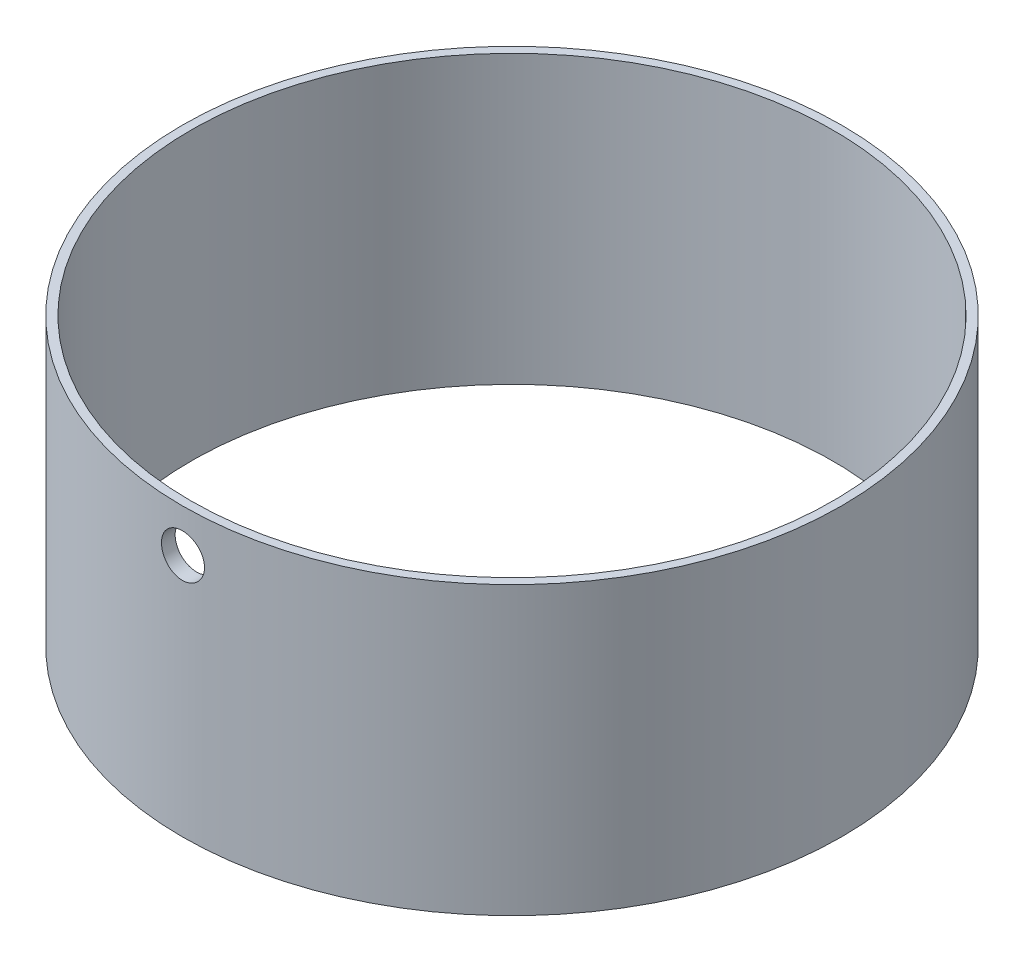
ISO-10303-21;
HEADER;
FILE_DESCRIPTION(('STEP AP214'),'2;1');
FILE_NAME('part.step','',(''),(''),'','','');
FILE_SCHEMA(('AUTOMOTIVE_DESIGN { 1 0 10303 214 1 1 1 1 }'));
ENDSEC;
DATA;
#1=APPLICATION_CONTEXT('core data for automotive mechanical design processes');
#2=APPLICATION_PROTOCOL_DEFINITION('international standard','automotive_design',2000,#1);
#3=PRODUCT_CONTEXT('',#1,'mechanical');
#4=PRODUCT('Part','Part','',(#3));
#5=PRODUCT_RELATED_PRODUCT_CATEGORY('part','',(#4));
#6=PRODUCT_DEFINITION_FORMATION('','',#4);
#7=PRODUCT_DEFINITION_CONTEXT('part definition',#1,'design');
#8=PRODUCT_DEFINITION('design','',#6,#7);
#9=PRODUCT_DEFINITION_SHAPE('','',#8);
#10=(LENGTH_UNIT() NAMED_UNIT(*) SI_UNIT(.MILLI.,.METRE.));
#11=(NAMED_UNIT(*) PLANE_ANGLE_UNIT() SI_UNIT($,.RADIAN.));
#12=(NAMED_UNIT(*) SI_UNIT($,.STERADIAN.) SOLID_ANGLE_UNIT());
#13=UNCERTAINTY_MEASURE_WITH_UNIT(LENGTH_MEASURE(1.E-05),#10,'distance_accuracy_value','');
#14=(GEOMETRIC_REPRESENTATION_CONTEXT(3) GLOBAL_UNCERTAINTY_ASSIGNED_CONTEXT((#13)) GLOBAL_UNIT_ASSIGNED_CONTEXT((#10,
#11,#12)) REPRESENTATION_CONTEXT('',''));
#15=CARTESIAN_POINT('',(0.,0.,0.));
#16=DIRECTION('',(0.,0.,1.));
#17=DIRECTION('',(1.,0.,0.));
#18=AXIS2_PLACEMENT_3D('',#15,#16,#17);
#19=CARTESIAN_POINT('',(0.,0.,0.));
#20=DIRECTION('',(0.,1.,0.));
#21=DIRECTION('',(0.,0.,1.));
#22=AXIS2_PLACEMENT_3D('',#19,#20,#21);
#23=CYLINDRICAL_SURFACE('',#22,112.);
#24=CARTESIAN_POINT('',(0.,100.,0.));
#25=DIRECTION('',(0.,1.,0.));
#26=DIRECTION('',(0.,0.,1.));
#27=AXIS2_PLACEMENT_3D('',#24,#25,#26);
#28=CIRCLE('',#27,112.);
#29=CARTESIAN_POINT('',(0.,100.,112.));
#30=VERTEX_POINT('',#29);
#31=EDGE_CURVE('E118',#30,#30,#28,.T.);
#32=ORIENTED_EDGE('',*,*,#31,.T.);
#33=EDGE_LOOP('',(#32));
#34=FACE_BOUND('',#33,.T.);
#35=CARTESIAN_POINT('',(0.,0.,0.));
#36=DIRECTION('',(0.,1.,0.));
#37=DIRECTION('',(0.,0.,1.));
#38=AXIS2_PLACEMENT_3D('',#35,#36,#37);
#39=CIRCLE('',#38,112.);
#40=CARTESIAN_POINT('',(0.,0.,112.));
#41=VERTEX_POINT('',#40);
#42=EDGE_CURVE('E119',#41,#41,#39,.T.);
#43=ORIENTED_EDGE('',*,*,#42,.F.);
#44=EDGE_LOOP('',(#43));
#45=FACE_BOUND('',#44,.T.);
#46=DIRECTION('',(0.,1.,0.));
#47=VECTOR('',#46,1.);
#48=CARTESIAN_POINT('',(-11.8113619735154,0.,111.375453886081));
#49=LINE('',#48,#47);
#50=CARTESIAN_POINT('',(-11.8113619735154,69.,111.375453886081));
#51=VERTEX_POINT('',#50);
#52=CARTESIAN_POINT('',(-11.8113619735154,95.,111.375453886081));
#53=VERTEX_POINT('',#52);
#54=EDGE_CURVE('E11',#51,#53,#49,.T.);
#55=ORIENTED_EDGE('',*,*,#54,.F.);
#56=CARTESIAN_POINT('',(0.,69.,0.));
#57=DIRECTION('',(0.,1.,0.));
#58=DIRECTION('',(0.,0.,1.));
#59=AXIS2_PLACEMENT_3D('',#56,#57,#58);
#60=CIRCLE('',#59,112.);
#61=CARTESIAN_POINT('',(12.1886380264846,69.,111.334797359403));
#62=VERTEX_POINT('',#61);
#63=EDGE_CURVE('E55',#62,#51,#60,.F.);
#64=ORIENTED_EDGE('',*,*,#63,.F.);
#65=DIRECTION('',(0.,1.,0.));
#66=VECTOR('',#65,1.);
#67=CARTESIAN_POINT('',(12.1886380264846,0.,111.334797359403));
#68=LINE('',#67,#66);
#69=CARTESIAN_POINT('',(12.1886380264846,95.,111.334797359403));
#70=VERTEX_POINT('',#69);
#71=EDGE_CURVE('E153',#70,#62,#68,.F.);
#72=ORIENTED_EDGE('',*,*,#71,.F.);
#73=CARTESIAN_POINT('',(0.,95.,0.));
#74=DIRECTION('',(0.,-1.,0.));
#75=DIRECTION('',(0.,0.,-1.));
#76=AXIS2_PLACEMENT_3D('',#73,#74,#75);
#77=CIRCLE('',#76,112.);
#78=EDGE_CURVE('E48',#53,#70,#77,.F.);
#79=ORIENTED_EDGE('',*,*,#78,.F.);
#80=EDGE_LOOP('',(#55,#64,#72,#79));
#81=FACE_BOUND('',#80,.T.);
#82=ADVANCED_FACE('F39',(#34,#45,#81),#23,.F.);
#83=CARTESIAN_POINT('',(0.,85.,115.));
#84=DIRECTION('',(0.,0.,-1.));
#85=DIRECTION('',(-1.,0.,0.));
#86=AXIS2_PLACEMENT_3D('',#83,#84,#85);
#87=CYLINDRICAL_SURFACE('',#86,7.5);
#88=CARTESIAN_POINT('',(0.,77.5,115.));
#89=CARTESIAN_POINT('',(0.210474437116549,77.4999982600035,115.000000312665));
#90=CARTESIAN_POINT('',(0.420921203214331,77.5088634147188,114.999420984195));
#91=CARTESIAN_POINT('',(0.840385809894541,77.5442605031269,114.997120521563));
#92=CARTESIAN_POINT('',(1.04940327510685,77.5707969103353,114.995399098278));
#93=CARTESIAN_POINT('',(1.46462725009668,77.6413820683434,114.99086060133));
#94=CARTESIAN_POINT('',(1.67083121296599,77.6854457217624,114.988042595337));
#95=CARTESIAN_POINT('',(2.07885902563251,77.7907867532695,114.981389771491));
#96=CARTESIAN_POINT('',(2.28068124474147,77.8520704254684,114.977554581876));
#97=CARTESIAN_POINT('',(2.67825253362003,77.9913418565619,114.968980455738));
#98=CARTESIAN_POINT('',(2.87400691294481,78.0693145109448,114.964242336842));
#99=CARTESIAN_POINT('',(3.25831807573895,78.2414711128006,114.953992238501));
#100=CARTESIAN_POINT('',(3.44687217839751,78.33566102776,114.948479974329));
#101=CARTESIAN_POINT('',(3.81526256188343,78.5394999625754,114.936842304033));
#102=CARTESIAN_POINT('',(3.9951039903634,78.6491397008617,114.930717266672));
#103=CARTESIAN_POINT('',(4.34498611503264,78.8831862161373,114.918021901165));
#104=CARTESIAN_POINT('',(4.51502316360376,79.0075984370824,114.911451409246));
#105=CARTESIAN_POINT('',(4.84419995827742,79.2704161250919,114.898045658649));
#106=CARTESIAN_POINT('',(5.00332796520436,79.4088362815261,114.891210126768));
#107=CARTESIAN_POINT('',(5.3094209529795,79.698633720509,114.877471833506));
#108=CARTESIAN_POINT('',(5.45638141884931,79.8500157707857,114.870569048222));
#109=CARTESIAN_POINT('',(5.7370127827864,80.1645985958104,114.856895410108));
#110=CARTESIAN_POINT('',(5.87068566738485,80.327797597566,114.850124537679));
#111=CARTESIAN_POINT('',(6.12382156322772,80.6648833620762,114.836905562634));
#112=CARTESIAN_POINT('',(6.24328435884064,80.8387702869544,114.830457464917));
#113=CARTESIAN_POINT('',(6.46724581204258,81.1961545214373,114.818061848391));
#114=CARTESIAN_POINT('',(6.57173145788298,81.3796600006532,114.812114766678));
#115=CARTESIAN_POINT('',(6.76487226423058,81.754846487637,114.800896626755));
#116=CARTESIAN_POINT('',(6.85352704251246,81.9465276926637,114.79562558487));
#117=CARTESIAN_POINT('',(7.01435231829256,82.3366618298179,114.785910959871));
#118=CARTESIAN_POINT('',(7.08652601885355,82.5351134374999,114.781467216006));
#119=CARTESIAN_POINT('',(7.21391465008896,82.9374814912433,114.773531415436));
#120=CARTESIAN_POINT('',(7.26912371125492,83.1413998022302,114.770039688162));
#121=CARTESIAN_POINT('',(7.36207580073377,83.552847491273,114.764114634974));
#122=CARTESIAN_POINT('',(7.39984691594251,83.760370499848,114.761679607442));
#123=CARTESIAN_POINT('',(7.45778278073224,84.177873016836,114.757929227638));
#124=CARTESIAN_POINT('',(7.47794728160642,84.3878525599071,114.756613891183));
#125=CARTESIAN_POINT('',(7.50052298101,84.8087617344913,114.755140554855));
#126=CARTESIAN_POINT('',(7.50293470356043,85.019691337777,114.754982520822));
#127=CARTESIAN_POINT('',(7.48998887602254,85.4410065424369,114.755828210478));
#128=CARTESIAN_POINT('',(7.47463094710231,85.6513921321173,114.756831958936));
#129=CARTESIAN_POINT('',(7.42629690379599,86.0697555434093,114.759969929704));
#130=CARTESIAN_POINT('',(7.393351086136,86.277736879021,114.762102207965));
#131=CARTESIAN_POINT('',(7.31008588573259,86.6902491763605,114.767436068085));
#132=CARTESIAN_POINT('',(7.259760501802,86.8947789206284,114.77063801929));
#133=CARTESIAN_POINT('',(7.14210857043562,87.2988075216001,114.77801949689));
#134=CARTESIAN_POINT('',(7.07478802791496,87.4983081279274,114.782198677962));
#135=CARTESIAN_POINT('',(6.92363478780581,87.8909551547084,114.791415133942));
#136=CARTESIAN_POINT('',(6.83979599379178,88.0840991983244,114.796452725575));
#137=CARTESIAN_POINT('',(6.56423847123483,88.6520525523665,114.812651019956));
#138=CARTESIAN_POINT('',(6.34844223001602,89.0155075833754,114.824899646239));
#139=CARTESIAN_POINT('',(5.85912602965126,89.7008722380952,114.850905081526));
#140=CARTESIAN_POINT('',(5.58560536202118,90.0227813518118,114.864661909041));
#141=CARTESIAN_POINT('',(4.98789421918536,90.6168195237607,114.892168470709));
#142=CARTESIAN_POINT('',(4.66361006996649,90.8888544929415,114.905918143635));
#143=CARTESIAN_POINT('',(3.97393237573921,91.374622195937,114.931835196811));
#144=CARTESIAN_POINT('',(3.60853881514294,91.5883549076444,114.944002576462));
#145=CARTESIAN_POINT('',(2.84694960861669,91.9514630087612,114.965385377123));
#146=CARTESIAN_POINT('',(2.45075222369326,92.10083476163,114.974600631325));
#147=CARTESIAN_POINT('',(1.63882966935984,92.3309121852939,114.989038494438));
#148=CARTESIAN_POINT('',(1.22310474829946,92.4116187291181,114.994261154111));
#149=CARTESIAN_POINT('',(0.384744921430254,92.5019596487931,115.000118821097));
#150=CARTESIAN_POINT('',(-0.0378758956925053,92.5117242460287,115.000762234053));
#151=CARTESIAN_POINT('',(-0.87874991134543,92.4602427967461,114.997411230718));
#152=CARTESIAN_POINT('',(-1.29700313464051,92.3989971530876,114.993416840739));
#153=CARTESIAN_POINT('',(-2.11689893494385,92.2073464264091,114.981245399696));
#154=CARTESIAN_POINT('',(-2.51855555444872,92.0770011564777,114.973071966257));
#155=CARTESIAN_POINT('',(-3.29430141539149,91.7508943394925,114.953461287064));
#156=CARTESIAN_POINT('',(-3.66839038703319,91.5551321523269,114.942024009373));
#157=CARTESIAN_POINT('',(-4.37893566660289,91.103483257213,114.917151453097));
#158=CARTESIAN_POINT('',(-4.71533658968645,90.847509732676,114.903713299887));
#159=CARTESIAN_POINT('',(-5.34055702351906,90.2825847698128,114.876353293706));
#160=CARTESIAN_POINT('',(-5.6293760251832,89.9736327647352,114.862431435563));
#161=CARTESIAN_POINT('',(-6.02069956349136,89.477264847155,114.84236300708));
#162=CARTESIAN_POINT('',(-6.14428822416664,89.3060778358319,114.835801357969));
#163=CARTESIAN_POINT('',(-6.37660326234128,88.9539025779701,114.823135494917));
#164=CARTESIAN_POINT('',(-6.48533476980826,88.7729177447726,114.817031123415));
#165=CARTESIAN_POINT('',(-6.68717283108972,88.4023901590299,114.805452627013));
#166=CARTESIAN_POINT('',(-6.78027656052971,88.2128458673906,114.799978616092));
#167=CARTESIAN_POINT('',(-6.95018190346499,87.8265672141046,114.78981756477));
#168=CARTESIAN_POINT('',(-7.02698391802108,87.629833029486,114.78513050501));
#169=CARTESIAN_POINT('',(-7.163680895347,87.2307258043232,114.776680413422));
#170=CARTESIAN_POINT('',(-7.22358873637973,87.0283571888574,114.77291667804));
#171=CARTESIAN_POINT('',(-7.32614473283694,86.6192798510355,114.766416021141));
#172=CARTESIAN_POINT('',(-7.36879318586623,86.4125712035795,114.763679081919));
#173=CARTESIAN_POINT('',(-7.43653020977399,85.9962457575212,114.759309743709));
#174=CARTESIAN_POINT('',(-7.46161554165113,85.7866284297638,114.757677548461));
#175=CARTESIAN_POINT('',(-7.49402629041141,85.3660976423265,114.755565593185));
#176=CARTESIAN_POINT('',(-7.50135829563902,85.1551846925983,114.755085405641));
#177=CARTESIAN_POINT('',(-7.49823096303315,84.7338100278593,114.75528978919));
#178=CARTESIAN_POINT('',(-7.4877984681131,84.5233481123314,114.755972602939));
#179=CARTESIAN_POINT('',(-7.4492754099319,84.1041272186152,114.758479717536));
#180=CARTESIAN_POINT('',(-7.42119097594633,83.8953676747901,114.760303622163));
#181=CARTESIAN_POINT('',(-7.34756484037486,83.4809228063371,114.765041060912));
#182=CARTESIAN_POINT('',(-7.30201990116062,83.2752380592092,114.767954797114));
#183=CARTESIAN_POINT('',(-7.19380149728516,82.8684473809577,114.77478885205));
#184=CARTESIAN_POINT('',(-7.13112842171625,82.6673413459339,114.778709147919));
#185=CARTESIAN_POINT('',(-6.98910182066356,82.2711274724784,114.787444929511));
#186=CARTESIAN_POINT('',(-6.90974821497536,82.0760196628929,114.792260419539));
#187=CARTESIAN_POINT('',(-6.7349284411791,81.6931859295697,114.802649800523));
#188=CARTESIAN_POINT('',(-6.63946249788545,81.5054599028794,114.808223680897));
#189=CARTESIAN_POINT('',(-6.43307939896203,81.1386819992262,114.819972864397));
#190=CARTESIAN_POINT('',(-6.3221597158482,80.9596315476369,114.826148265854));
#191=CARTESIAN_POINT('',(-6.08571115721519,80.6115642427985,114.838922522909));
#192=CARTESIAN_POINT('',(-5.96018764821724,80.4425437380702,114.845521222559));
#193=CARTESIAN_POINT('',(-5.69510487592841,80.1153083932342,114.858971890283));
#194=CARTESIAN_POINT('',(-5.55551643746454,79.9571172067254,114.865824365354));
#195=CARTESIAN_POINT('',(-5.26356855839562,79.653108981579,114.879572541445));
#196=CARTESIAN_POINT('',(-5.11121382685643,79.5072874197868,114.886468225665));
#197=CARTESIAN_POINT('',(-4.79466840121383,79.2288989587069,114.900114274919));
#198=CARTESIAN_POINT('',(-4.63047050229555,79.0963402469565,114.906864548193));
#199=CARTESIAN_POINT('',(-4.29154575509974,78.845565960548,114.920021663828));
#200=CARTESIAN_POINT('',(-4.1168228134476,78.7273451125447,114.926428631967));
#201=CARTESIAN_POINT('',(-3.75772661826366,78.5058435639441,114.938730692614));
#202=CARTESIAN_POINT('',(-3.57333765340372,78.4025882828254,114.944624907561));
#203=CARTESIAN_POINT('',(-3.19655980920852,78.2120283326578,114.955719781945));
#204=CARTESIAN_POINT('',(-3.00417388481335,78.1247178350839,114.960920694627));
#205=CARTESIAN_POINT('',(-2.61287070421413,77.9666945253941,114.970479532431));
#206=CARTESIAN_POINT('',(-2.41395922180777,77.8959674689394,114.974838180444));
#207=CARTESIAN_POINT('',(-2.01093254173982,77.7715403235778,114.982593386518));
#208=CARTESIAN_POINT('',(-1.80681868802593,77.7178358843712,114.985990190362));
#209=CARTESIAN_POINT('',(-1.33814703258273,77.6154490806849,114.992513921863));
#210=CARTESIAN_POINT('',(-1.07238116365245,77.5721944362933,114.995310662731));
#211=CARTESIAN_POINT('',(-0.537728477976593,77.5144710290718,114.999053500708));
#212=CARTESIAN_POINT('',(-0.268841665971967,77.5000022225196,114.999999600629));
#213=CARTESIAN_POINT('',(0.,77.5,115.));
#214=B_SPLINE_CURVE_WITH_KNOTS('',3,(#88,#89,#90,#91,#92,#93,#94,#95,#96,#97,#98,#99,#100,#101,
#102,#103,#104,#105,#106,#107,#108,#109,#110,#111,#112,#113,#114,#115,#116,#117,#118,#119,#120,
#121,#122,#123,#124,#125,#126,#127,#128,#129,#130,#131,#132,#133,#134,#135,#136,#137,#138,#139,
#140,#141,#142,#143,#144,#145,#146,#147,#148,#149,#150,#151,#152,#153,#154,#155,#156,#157,#158,
#159,#160,#161,#162,#163,#164,#165,#166,#167,#168,#169,#170,#171,#172,#173,#174,#175,#176,#177,
#178,#179,#180,#181,#182,#183,#184,#185,#186,#187,#188,#189,#190,#191,#192,#193,#194,#195,#196,
#197,#198,#199,#200,#201,#202,#203,#204,#205,#206,#207,#208,#209,#210,#211,#212,#213),
.UNSPECIFIED.,.T.,.F.,(4,2,2,2,2,2,2,2,2,2,2,2,2,2,2,2,2,2,2,2,2,2,2,2,2,2,2,2,2,2,2,2,2,2,2,2,
2,2,2,2,2,2,2,2,2,2,2,2,2,2,2,2,2,2,2,2,2,2,2,2,2,2,4),(0.,0.631188372774682,1.26253659302087,
1.894422771301,2.52654021219889,3.15808795064019,3.78986857913426,4.42127126720152,
5.05290736622181,5.68521283014065,6.31775188018549,6.95019622116655,7.58265015797301,
8.21565026628501,8.84866565587911,9.48155791536026,10.1146689000695,10.7467565590557,
11.3788531466156,12.0109310760686,12.6430224810643,13.2740285484493,13.9052527212838,
14.5362541744895,15.1674889504458,16.429574223298,17.6916749873286,18.9561327770606,
20.2205910462511,21.4851207508418,22.7496343775991,24.011826269116,25.274010999924,
26.5351049550563,27.7962112504939,29.0591471584803,30.3220965778982,30.9551991483439,
31.5880825619087,32.2210802322563,32.8540623275557,33.4865605943957,34.1190479545605,
34.7516519277202,35.3840211025134,36.0154355883582,36.6466309494392,37.2779434070851,
37.9092415246761,38.5405426777854,39.1718350231176,39.8032307387993,40.4343951617089,
41.0668968832335,41.6991663141446,42.3318236855266,42.9642476606501,43.5977335457967,
44.2309873982313,44.8636953084794,45.4962413932908,46.302467525746,47.1086924336426),.UNSPECIFIED.);
#215=CARTESIAN_POINT('',(0.,77.5,115.));
#216=VERTEX_POINT('',#215);
#217=EDGE_CURVE('E85',#216,#216,#214,.T.);
#218=ORIENTED_EDGE('',*,*,#217,.T.);
#219=EDGE_LOOP('',(#218));
#220=FACE_BOUND('',#219,.T.);
#221=CARTESIAN_POINT('',(0.,85.,110.));
#222=DIRECTION('',(0.,0.,-1.));
#223=DIRECTION('',(-1.,0.,0.));
#224=AXIS2_PLACEMENT_3D('',#221,#222,#223);
#225=CIRCLE('',#224,7.50000000000001);
#226=CARTESIAN_POINT('',(-7.50000000000001,85.,110.));
#227=VERTEX_POINT('',#226);
#228=EDGE_CURVE('E100',#227,#227,#225,.T.);
#229=ORIENTED_EDGE('',*,*,#228,.T.);
#230=EDGE_LOOP('',(#229));
#231=FACE_BOUND('',#230,.T.);
#232=ADVANCED_FACE('F121',(#220,#231),#87,.F.);
#233=CARTESIAN_POINT('',(0.,100.,0.));
#234=DIRECTION('',(0.,-1.,0.));
#235=DIRECTION('',(0.,0.,-1.));
#236=AXIS2_PLACEMENT_3D('',#233,#234,#235);
#237=CYLINDRICAL_SURFACE('',#236,115.);
#238=CARTESIAN_POINT('',(0.,100.,0.));
#239=DIRECTION('',(0.,1.,0.));
#240=DIRECTION('',(0.,0.,1.));
#241=AXIS2_PLACEMENT_3D('',#238,#239,#240);
#242=CIRCLE('',#241,115.);
#243=CARTESIAN_POINT('',(0.,100.,115.));
#244=VERTEX_POINT('',#243);
#245=EDGE_CURVE('E147',#244,#244,#242,.T.);
#246=ORIENTED_EDGE('',*,*,#245,.F.);
#247=EDGE_LOOP('',(#246));
#248=FACE_BOUND('',#247,.T.);
#249=CARTESIAN_POINT('',(0.,0.,0.));
#250=DIRECTION('',(0.,1.,0.));
#251=DIRECTION('',(0.,0.,1.));
#252=AXIS2_PLACEMENT_3D('',#249,#250,#251);
#253=CIRCLE('',#252,115.);
#254=CARTESIAN_POINT('',(0.,0.,115.));
#255=VERTEX_POINT('',#254);
#256=EDGE_CURVE('E145',#255,#255,#253,.T.);
#257=ORIENTED_EDGE('',*,*,#256,.T.);
#258=EDGE_LOOP('',(#257));
#259=FACE_BOUND('',#258,.T.);
#260=ORIENTED_EDGE('',*,*,#217,.F.);
#261=EDGE_LOOP('',(#260));
#262=FACE_BOUND('',#261,.T.);
#263=ADVANCED_FACE('F41',(#248,#259,#262),#237,.T.);
#264=CARTESIAN_POINT('',(0.,100.,0.));
#265=DIRECTION('',(0.,1.,0.));
#266=DIRECTION('',(0.,0.,1.));
#267=AXIS2_PLACEMENT_3D('',#264,#265,#266);
#268=PLANE('',#267);
#269=ORIENTED_EDGE('',*,*,#31,.F.);
#270=EDGE_LOOP('',(#269));
#271=FACE_BOUND('',#270,.T.);
#272=ORIENTED_EDGE('',*,*,#245,.T.);
#273=EDGE_LOOP('',(#272));
#274=FACE_BOUND('',#273,.T.);
#275=ADVANCED_FACE('F131',(#271,#274),#268,.T.);
#276=CARTESIAN_POINT('',(0.,0.,0.));
#277=DIRECTION('',(0.,1.,0.));
#278=DIRECTION('',(0.,0.,1.));
#279=AXIS2_PLACEMENT_3D('',#276,#277,#278);
#280=PLANE('',#279);
#281=ORIENTED_EDGE('',*,*,#42,.T.);
#282=EDGE_LOOP('',(#281));
#283=FACE_BOUND('',#282,.T.);
#284=ORIENTED_EDGE('',*,*,#256,.F.);
#285=EDGE_LOOP('',(#284));
#286=FACE_BOUND('',#285,.T.);
#287=ADVANCED_FACE('F133',(#283,#286),#280,.F.);
#288=CARTESIAN_POINT('',(-11.8113619735154,95.,112.));
#289=DIRECTION('',(1.,0.,0.));
#290=DIRECTION('',(0.,1.,0.));
#291=AXIS2_PLACEMENT_3D('',#288,#289,#290);
#292=PLANE('',#291);
#293=DIRECTION('',(0.,0.,-1.));
#294=VECTOR('',#293,1.);
#295=CARTESIAN_POINT('',(-11.8113619735154,69.,112.));
#296=LINE('',#295,#294);
#297=CARTESIAN_POINT('',(-11.8113619735154,69.,110.));
#298=VERTEX_POINT('',#297);
#299=EDGE_CURVE('E78',#51,#298,#296,.T.);
#300=ORIENTED_EDGE('',*,*,#299,.F.);
#301=ORIENTED_EDGE('',*,*,#54,.T.);
#302=DIRECTION('',(0.,0.,-1.));
#303=VECTOR('',#302,1.);
#304=CARTESIAN_POINT('',(-11.8113619735154,95.,112.));
#305=LINE('',#304,#303);
#306=CARTESIAN_POINT('',(-11.8113619735154,95.,110.));
#307=VERTEX_POINT('',#306);
#308=EDGE_CURVE('E98',#53,#307,#305,.T.);
#309=ORIENTED_EDGE('',*,*,#308,.T.);
#310=DIRECTION('',(0.,-1.,0.));
#311=VECTOR('',#310,1.);
#312=CARTESIAN_POINT('',(-11.8113619735154,95.,110.));
#313=LINE('',#312,#311);
#314=EDGE_CURVE('E92',#307,#298,#313,.T.);
#315=ORIENTED_EDGE('',*,*,#314,.T.);
#316=EDGE_LOOP('',(#300,#301,#309,#315));
#317=FACE_BOUND('',#316,.T.);
#318=ADVANCED_FACE('F96',(#317),#292,.F.);
#319=CARTESIAN_POINT('',(12.1886380264846,69.,112.));
#320=DIRECTION('',(0.,1.,0.));
#321=DIRECTION('',(0.,0.,1.));
#322=AXIS2_PLACEMENT_3D('',#319,#320,#321);
#323=PLANE('',#322);
#324=ORIENTED_EDGE('',*,*,#63,.T.);
#325=ORIENTED_EDGE('',*,*,#299,.T.);
#326=DIRECTION('',(1.,0.,0.));
#327=VECTOR('',#326,1.);
#328=CARTESIAN_POINT('',(12.1886380264846,69.,110.));
#329=LINE('',#328,#327);
#330=CARTESIAN_POINT('',(12.1886380264846,69.,110.));
#331=VERTEX_POINT('',#330);
#332=EDGE_CURVE('E81',#298,#331,#329,.T.);
#333=ORIENTED_EDGE('',*,*,#332,.T.);
#334=DIRECTION('',(0.,0.,-1.));
#335=VECTOR('',#334,1.);
#336=CARTESIAN_POINT('',(12.1886380264846,69.,112.));
#337=LINE('',#336,#335);
#338=EDGE_CURVE('E86',#62,#331,#337,.T.);
#339=ORIENTED_EDGE('',*,*,#338,.F.);
#340=EDGE_LOOP('',(#324,#325,#333,#339));
#341=FACE_BOUND('',#340,.T.);
#342=ADVANCED_FACE('F80',(#341),#323,.F.);
#343=CARTESIAN_POINT('',(12.1886380264846,95.,112.));
#344=DIRECTION('',(-1.,0.,0.));
#345=DIRECTION('',(0.,-1.,0.));
#346=AXIS2_PLACEMENT_3D('',#343,#344,#345);
#347=PLANE('',#346);
#348=DIRECTION('',(0.,0.,-1.));
#349=VECTOR('',#348,1.);
#350=CARTESIAN_POINT('',(12.1886380264846,95.,112.));
#351=LINE('',#350,#349);
#352=CARTESIAN_POINT('',(12.1886380264846,95.,110.));
#353=VERTEX_POINT('',#352);
#354=EDGE_CURVE('E109',#70,#353,#351,.T.);
#355=ORIENTED_EDGE('',*,*,#354,.F.);
#356=ORIENTED_EDGE('',*,*,#71,.T.);
#357=ORIENTED_EDGE('',*,*,#338,.T.);
#358=DIRECTION('',(0.,1.,0.));
#359=VECTOR('',#358,1.);
#360=CARTESIAN_POINT('',(12.1886380264846,95.,110.));
#361=LINE('',#360,#359);
#362=EDGE_CURVE('E94',#331,#353,#361,.T.);
#363=ORIENTED_EDGE('',*,*,#362,.T.);
#364=EDGE_LOOP('',(#355,#356,#357,#363));
#365=FACE_BOUND('',#364,.T.);
#366=ADVANCED_FACE('F159',(#365),#347,.F.);
#367=CARTESIAN_POINT('',(12.1886380264846,95.,112.));
#368=DIRECTION('',(0.,-1.,0.));
#369=DIRECTION('',(0.,0.,-1.));
#370=AXIS2_PLACEMENT_3D('',#367,#368,#369);
#371=PLANE('',#370);
#372=ORIENTED_EDGE('',*,*,#308,.F.);
#373=ORIENTED_EDGE('',*,*,#78,.T.);
#374=ORIENTED_EDGE('',*,*,#354,.T.);
#375=DIRECTION('',(-1.,0.,0.));
#376=VECTOR('',#375,1.);
#377=CARTESIAN_POINT('',(12.1886380264846,95.,110.));
#378=LINE('',#377,#376);
#379=EDGE_CURVE('E106',#353,#307,#378,.T.);
#380=ORIENTED_EDGE('',*,*,#379,.T.);
#381=EDGE_LOOP('',(#372,#373,#374,#380));
#382=FACE_BOUND('',#381,.T.);
#383=ADVANCED_FACE('F157',(#382),#371,.F.);
#384=CARTESIAN_POINT('',(0.,0.,110.));
#385=DIRECTION('',(0.,0.,-1.));
#386=DIRECTION('',(-1.,0.,0.));
#387=AXIS2_PLACEMENT_3D('',#384,#385,#386);
#388=PLANE('',#387);
#389=ORIENTED_EDGE('',*,*,#228,.F.);
#390=EDGE_LOOP('',(#389));
#391=FACE_BOUND('',#390,.T.);
#392=ORIENTED_EDGE('',*,*,#314,.F.);
#393=ORIENTED_EDGE('',*,*,#379,.F.);
#394=ORIENTED_EDGE('',*,*,#362,.F.);
#395=ORIENTED_EDGE('',*,*,#332,.F.);
#396=EDGE_LOOP('',(#392,#393,#394,#395));
#397=FACE_BOUND('',#396,.T.);
#398=ADVANCED_FACE('F90',(#391,#397),#388,.T.);
#399=CLOSED_SHELL('',(#82,#232,#263,#275,#287,#318,#342,#366,#383,#398));
#400=MANIFOLD_SOLID_BREP('B2',#399);
#401=ADVANCED_BREP_SHAPE_REPRESENTATION('',(#18,#400),#14);
#402=SHAPE_DEFINITION_REPRESENTATION(#9,#401);
ENDSEC;
END-ISO-10303-21;
